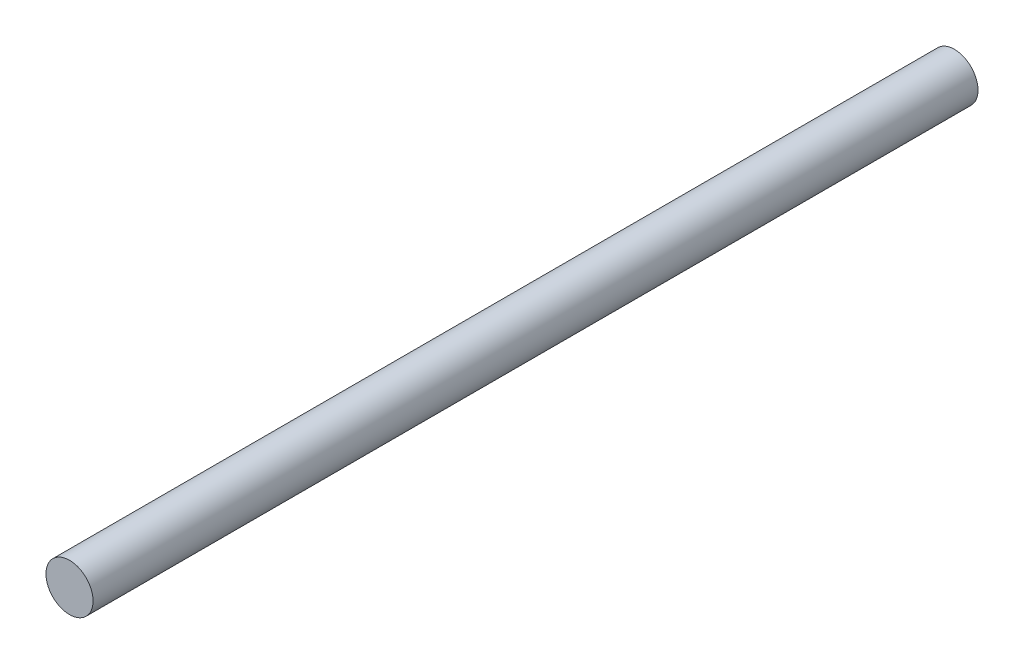
ISO-10303-21;
HEADER;
FILE_DESCRIPTION(('STEP AP214'),'2;1');
FILE_NAME('part.step','',(''),(''),'','','');
FILE_SCHEMA(('AUTOMOTIVE_DESIGN { 1 0 10303 214 1 1 1 1 }'));
ENDSEC;
DATA;
#1=APPLICATION_CONTEXT('core data for automotive mechanical design processes');
#2=APPLICATION_PROTOCOL_DEFINITION('international standard','automotive_design',2000,#1);
#3=PRODUCT_CONTEXT('',#1,'mechanical');
#4=PRODUCT('Part','Part','',(#3));
#5=PRODUCT_RELATED_PRODUCT_CATEGORY('part','',(#4));
#6=PRODUCT_DEFINITION_FORMATION('','',#4);
#7=PRODUCT_DEFINITION_CONTEXT('part definition',#1,'design');
#8=PRODUCT_DEFINITION('design','',#6,#7);
#9=PRODUCT_DEFINITION_SHAPE('','',#8);
#10=(LENGTH_UNIT() NAMED_UNIT(*) SI_UNIT(.MILLI.,.METRE.));
#11=(NAMED_UNIT(*) PLANE_ANGLE_UNIT() SI_UNIT($,.RADIAN.));
#12=(NAMED_UNIT(*) SI_UNIT($,.STERADIAN.) SOLID_ANGLE_UNIT());
#13=UNCERTAINTY_MEASURE_WITH_UNIT(LENGTH_MEASURE(1.E-05),#10,'distance_accuracy_value','');
#14=(GEOMETRIC_REPRESENTATION_CONTEXT(3) GLOBAL_UNCERTAINTY_ASSIGNED_CONTEXT((#13)) GLOBAL_UNIT_ASSIGNED_CONTEXT((#10,
#11,#12)) REPRESENTATION_CONTEXT('',''));
#15=CARTESIAN_POINT('',(0.,0.,0.));
#16=DIRECTION('',(0.,0.,1.));
#17=DIRECTION('',(1.,0.,0.));
#18=AXIS2_PLACEMENT_3D('',#15,#16,#17);
#19=CARTESIAN_POINT('',(0.,0.,146.5));
#20=DIRECTION('',(0.,0.,-1.));
#21=DIRECTION('',(-1.,0.,0.));
#22=AXIS2_PLACEMENT_3D('',#19,#20,#21);
#23=CYLINDRICAL_SURFACE('',#22,3.9);
#24=CARTESIAN_POINT('',(0.,0.,146.5));
#25=DIRECTION('',(0.,0.,1.));
#26=DIRECTION('',(1.,0.,0.));
#27=AXIS2_PLACEMENT_3D('',#24,#25,#26);
#28=CIRCLE('',#27,3.9);
#29=CARTESIAN_POINT('',(3.9,0.,146.5));
#30=VERTEX_POINT('',#29);
#31=EDGE_CURVE('E10',#30,#30,#28,.T.);
#32=ORIENTED_EDGE('',*,*,#31,.F.);
#33=EDGE_LOOP('',(#32));
#34=FACE_BOUND('',#33,.T.);
#35=CARTESIAN_POINT('',(0.,0.,0.));
#36=DIRECTION('',(0.,0.,1.));
#37=DIRECTION('',(1.,0.,0.));
#38=AXIS2_PLACEMENT_3D('',#35,#36,#37);
#39=CIRCLE('',#38,3.9);
#40=CARTESIAN_POINT('',(3.9,0.,0.));
#41=VERTEX_POINT('',#40);
#42=EDGE_CURVE('E44',#41,#41,#39,.T.);
#43=ORIENTED_EDGE('',*,*,#42,.T.);
#44=EDGE_LOOP('',(#43));
#45=FACE_BOUND('',#44,.T.);
#46=ADVANCED_FACE('F41',(#34,#45),#23,.T.);
#47=CARTESIAN_POINT('',(0.,0.,146.5));
#48=DIRECTION('',(0.,0.,1.));
#49=DIRECTION('',(1.,0.,0.));
#50=AXIS2_PLACEMENT_3D('',#47,#48,#49);
#51=PLANE('',#50);
#52=ORIENTED_EDGE('',*,*,#31,.T.);
#53=EDGE_LOOP('',(#52));
#54=FACE_BOUND('',#53,.T.);
#55=ADVANCED_FACE('F58',(#54),#51,.T.);
#56=CARTESIAN_POINT('',(0.,0.,0.));
#57=DIRECTION('',(0.,0.,1.));
#58=DIRECTION('',(1.,0.,0.));
#59=AXIS2_PLACEMENT_3D('',#56,#57,#58);
#60=PLANE('',#59);
#61=ORIENTED_EDGE('',*,*,#42,.F.);
#62=EDGE_LOOP('',(#61));
#63=FACE_BOUND('',#62,.T.);
#64=ADVANCED_FACE('F56',(#63),#60,.F.);
#65=CLOSED_SHELL('',(#46,#55,#64));
#66=MANIFOLD_SOLID_BREP('B2',#65);
#67=ADVANCED_BREP_SHAPE_REPRESENTATION('',(#18,#66),#14);
#68=SHAPE_DEFINITION_REPRESENTATION(#9,#67);
ENDSEC;
END-ISO-10303-21;
